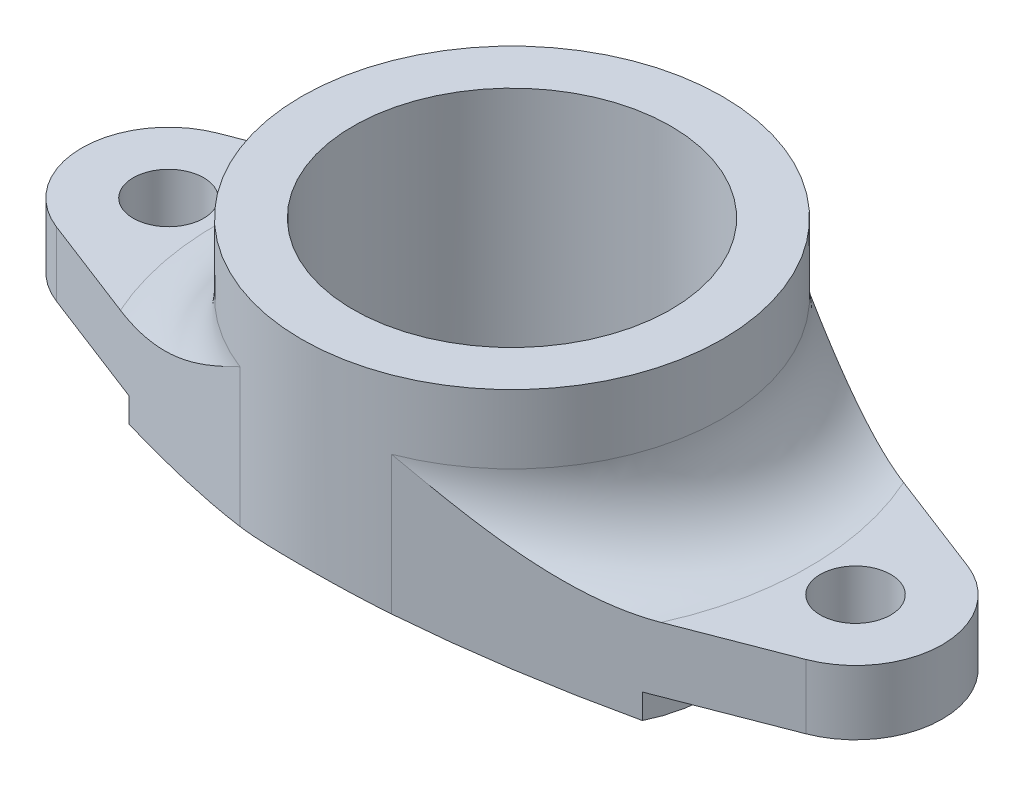
ISO-10303-21;
HEADER;
FILE_DESCRIPTION(('STEP AP214'),'2;1');
FILE_NAME('part.step','',(''),(''),'','','');
FILE_SCHEMA(('AUTOMOTIVE_DESIGN { 1 0 10303 214 1 1 1 1 }'));
ENDSEC;
DATA;
#1=APPLICATION_CONTEXT('core data for automotive mechanical design processes');
#2=APPLICATION_PROTOCOL_DEFINITION('international standard','automotive_design',2000,#1);
#3=PRODUCT_CONTEXT('',#1,'mechanical');
#4=PRODUCT('Part','Part','',(#3));
#5=PRODUCT_RELATED_PRODUCT_CATEGORY('part','',(#4));
#6=PRODUCT_DEFINITION_FORMATION('','',#4);
#7=PRODUCT_DEFINITION_CONTEXT('part definition',#1,'design');
#8=PRODUCT_DEFINITION('design','',#6,#7);
#9=PRODUCT_DEFINITION_SHAPE('','',#8);
#10=(LENGTH_UNIT() NAMED_UNIT(*) SI_UNIT(.MILLI.,.METRE.));
#11=(NAMED_UNIT(*) PLANE_ANGLE_UNIT() SI_UNIT($,.RADIAN.));
#12=(NAMED_UNIT(*) SI_UNIT($,.STERADIAN.) SOLID_ANGLE_UNIT());
#13=UNCERTAINTY_MEASURE_WITH_UNIT(LENGTH_MEASURE(1.E-05),#10,'distance_accuracy_value','');
#14=(GEOMETRIC_REPRESENTATION_CONTEXT(3) GLOBAL_UNCERTAINTY_ASSIGNED_CONTEXT((#13)) GLOBAL_UNIT_ASSIGNED_CONTEXT((#10,
#11,#12)) REPRESENTATION_CONTEXT('',''));
#15=CARTESIAN_POINT('',(0.,0.,0.));
#16=DIRECTION('',(0.,0.,1.));
#17=DIRECTION('',(1.,0.,0.));
#18=AXIS2_PLACEMENT_3D('',#15,#16,#17);
#19=CARTESIAN_POINT('',(43.636,30.,9.42281826207));
#20=DIRECTION('',(-0.36,0.,-0.932952303175248));
#21=DIRECTION('',(0.932952303175248,0.,-0.36));
#22=AXIS2_PLACEMENT_3D('',#19,#20,#21);
#23=PLANE('',#22);
#24=DIRECTION('',(-0.932952303175248,0.,0.36));
#25=VECTOR('',#24,1.);
#26=CARTESIAN_POINT('',(43.636,4.5,9.42281826207));
#27=LINE('',#26,#25);
#28=CARTESIAN_POINT('',(43.636,4.5,9.42281826207));
#29=VERTEX_POINT('',#28);
#30=CARTESIAN_POINT('',(29.9,4.5,14.7231535344844));
#31=VERTEX_POINT('',#30);
#32=EDGE_CURVE('E407',#29,#31,#27,.T.);
#33=ORIENTED_EDGE('',*,*,#32,.F.);
#34=DIRECTION('',(0.,-1.,0.));
#35=VECTOR('',#34,1.);
#36=CARTESIAN_POINT('',(43.636,30.,9.42281826207));
#37=LINE('',#36,#35);
#38=CARTESIAN_POINT('',(43.636,12.,9.42281826207));
#39=VERTEX_POINT('',#38);
#40=EDGE_CURVE('E192',#39,#29,#37,.T.);
#41=ORIENTED_EDGE('',*,*,#40,.F.);
#42=DIRECTION('',(-0.932952303175248,0.,0.36));
#43=VECTOR('',#42,1.);
#44=CARTESIAN_POINT('',(43.636,12.,9.42281826207));
#45=LINE('',#44,#43);
#46=CARTESIAN_POINT('',(31.4813327057347,12.,14.11296181072));
#47=VERTEX_POINT('',#46);
#48=EDGE_CURVE('E323',#39,#47,#45,.T.);
#49=ORIENTED_EDGE('',*,*,#48,.T.);
#50=CARTESIAN_POINT('',(31.4813327057347,12.,14.11296181072));
#51=CARTESIAN_POINT('',(31.1700685586209,12.0000073378621,14.2330698726001));
#52=CARTESIAN_POINT('',(30.858881958718,12.0082756531447,14.3531480111971));
#53=CARTESIAN_POINT('',(30.2373009510363,12.0403376641734,14.592998603777));
#54=CARTESIAN_POINT('',(29.9269063170056,12.0641262695667,14.7127711450642));
#55=CARTESIAN_POINT('',(28.9988953908541,12.1571533080661,15.0708644069357));
#56=CARTESIAN_POINT('',(28.3831053171273,12.2480616970877,15.3084804413108));
#57=CARTESIAN_POINT('',(27.1700427350477,12.4783617337853,15.7765671034717));
#58=CARTESIAN_POINT('',(26.5726319092312,12.6169420095842,16.0070911040685));
#59=CARTESIAN_POINT('',(25.3875116499694,12.9364455773876,16.4643956113646));
#60=CARTESIAN_POINT('',(24.7998075593472,13.1173914080871,16.6911740564189));
#61=CARTESIAN_POINT('',(23.529605424652,13.5518396718947,17.1813092615457));
#62=CARTESIAN_POINT('',(22.8492668772572,13.8125506148257,17.443832732712));
#63=CARTESIAN_POINT('',(21.5038393557871,14.3761332448327,17.9629952944858));
#64=CARTESIAN_POINT('',(20.838756392451,14.6790212283805,18.2196320657185));
#65=CARTESIAN_POINT('',(19.5223741345824,15.3195610469789,18.7275868788636));
#66=CARTESIAN_POINT('',(18.8710942979931,15.6572584712341,18.9788974125041));
#67=CARTESIAN_POINT('',(17.5817460114523,16.3601085811533,19.4764205780239));
#68=CARTESIAN_POINT('',(16.9436760951365,16.7252581984253,19.7226337757317));
#69=CARTESIAN_POINT('',(15.0355808605786,17.8586796799076,20.4589139500804));
#70=CARTESIAN_POINT('',(13.7824686767599,18.6594284513983,20.9424546248173));
#71=CARTESIAN_POINT('',(11.3010990860921,20.3011376891441,21.8999452163514));
#72=CARTESIAN_POINT('',(10.0728287032619,21.1420763477111,22.3739001402139));
#73=CARTESIAN_POINT('',(8.83640796593997,21.9887639871953,22.8510000561701));
#74=CARTESIAN_POINT('',(8.82820398356585,21.9943819936817,22.8541657417519));
#75=CARTESIAN_POINT('',(8.82,22.,22.8573314277936));
#76=B_SPLINE_CURVE_WITH_KNOTS('',3,(#50,#51,#52,#53,#54,#55,#56,#57,#58,#59,#60,#61,#62,#63,#64,
#65,#66,#67,#68,#69,#70,#71,#72,#73,#74,#75),.UNSPECIFIED.,.F.,.F.,(4,2,2,2,2,2,2,2,2,2,2,2,4),
(0.,1.00065964365005,2.00099125530701,3.99733968029431,5.96126632801906,7.92624017854258,
10.247928116096,12.5705156153744,14.8961845684978,17.2215939618567,21.9107675400965,
26.5974249619811,26.6287299136658),.UNSPECIFIED.);
#77=CARTESIAN_POINT('',(8.82000000000001,22.,22.8573314277936));
#78=VERTEX_POINT('',#77);
#79=EDGE_CURVE('E262',#78,#47,#76,.F.);
#80=ORIENTED_EDGE('',*,*,#79,.F.);
#81=DIRECTION('',(0.,-1.,0.));
#82=VECTOR('',#81,1.);
#83=CARTESIAN_POINT('',(8.82000000000001,30.,22.8573314277936));
#84=LINE('',#83,#82);
#85=CARTESIAN_POINT('',(8.82000000000001,5.89365821452919,22.8573314277936));
#86=VERTEX_POINT('',#85);
#87=EDGE_CURVE('E189',#78,#86,#84,.T.);
#88=ORIENTED_EDGE('',*,*,#87,.T.);
#89=CARTESIAN_POINT('',(55.0978846781216,30.,5.));
#90=DIRECTION('',(0.36,0.,0.932952303175248));
#91=DIRECTION('',(0.932952303175248,0.,-0.36));
#92=AXIS2_PLACEMENT_3D('',#89,#90,#91);
#93=ELLIPSE('',#92,83.3333333333333,30.);
#94=CARTESIAN_POINT('',(29.9,1.61936777756979,14.7231535344844));
#95=VERTEX_POINT('',#94);
#96=EDGE_CURVE('E210',#95,#86,#93,.F.);
#97=ORIENTED_EDGE('',*,*,#96,.F.);
#98=DIRECTION('',(0.,-1.,0.));
#99=VECTOR('',#98,1.);
#100=CARTESIAN_POINT('',(29.9,30.,14.7231535344844));
#101=LINE('',#100,#99);
#102=EDGE_CURVE('E169',#31,#95,#101,.T.);
#103=ORIENTED_EDGE('',*,*,#102,.F.);
#104=EDGE_LOOP('',(#33,#41,#49,#80,#88,#97,#103));
#105=FACE_BOUND('',#104,.T.);
#106=ADVANCED_FACE('F39',(#105),#23,.F.);
#107=CARTESIAN_POINT('',(-43.636,30.,9.42281826207));
#108=DIRECTION('',(0.36,0.,-0.932952303175248));
#109=DIRECTION('',(0.932952303175248,0.,0.36));
#110=AXIS2_PLACEMENT_3D('',#107,#108,#109);
#111=PLANE('',#110);
#112=CARTESIAN_POINT('',(-55.0978846781216,30.,5.));
#113=DIRECTION('',(-0.36,0.,0.932952303175248));
#114=DIRECTION('',(0.932952303175248,0.,0.36));
#115=AXIS2_PLACEMENT_3D('',#112,#113,#114);
#116=ELLIPSE('',#115,83.3333333333333,30.);
#117=CARTESIAN_POINT('',(-8.81999999999999,5.89365821452922,22.8573314277936));
#118=VERTEX_POINT('',#117);
#119=CARTESIAN_POINT('',(-29.9,1.61936777756979,14.7231535344844));
#120=VERTEX_POINT('',#119);
#121=EDGE_CURVE('E348',#118,#120,#116,.F.);
#122=ORIENTED_EDGE('',*,*,#121,.F.);
#123=DIRECTION('',(0.,-1.,0.));
#124=VECTOR('',#123,1.);
#125=CARTESIAN_POINT('',(-8.82000000000001,30.,22.8573314277936));
#126=LINE('',#125,#124);
#127=CARTESIAN_POINT('',(-8.82000000000001,22.,22.8573314277936));
#128=VERTEX_POINT('',#127);
#129=EDGE_CURVE('E186',#128,#118,#126,.T.);
#130=ORIENTED_EDGE('',*,*,#129,.F.);
#131=CARTESIAN_POINT('',(-31.4813327057347,12.,14.11296181072));
#132=CARTESIAN_POINT('',(-31.1700685586209,12.0000073378621,14.2330698726001));
#133=CARTESIAN_POINT('',(-30.858881958718,12.0082756531447,14.3531480111971));
#134=CARTESIAN_POINT('',(-30.2373009510363,12.0403376641734,14.592998603777));
#135=CARTESIAN_POINT('',(-29.9269063170056,12.0641262695667,14.7127711450642));
#136=CARTESIAN_POINT('',(-28.9988953908541,12.1571533080661,15.0708644069357));
#137=CARTESIAN_POINT('',(-28.3831053171273,12.2480616970877,15.3084804413108));
#138=CARTESIAN_POINT('',(-27.1700427350477,12.4783617337853,15.7765671034717));
#139=CARTESIAN_POINT('',(-26.5726319092312,12.6169420095842,16.0070911040685));
#140=CARTESIAN_POINT('',(-25.3875116499694,12.9364455773876,16.4643956113646));
#141=CARTESIAN_POINT('',(-24.7998075593472,13.1173914080871,16.6911740564189));
#142=CARTESIAN_POINT('',(-23.529605424652,13.5518396718947,17.1813092615457));
#143=CARTESIAN_POINT('',(-22.8492668772572,13.8125506148257,17.443832732712));
#144=CARTESIAN_POINT('',(-21.5038393557871,14.3761332448327,17.9629952944858));
#145=CARTESIAN_POINT('',(-20.838756392451,14.6790212283805,18.2196320657185));
#146=CARTESIAN_POINT('',(-19.5223741345824,15.3195610469789,18.7275868788636));
#147=CARTESIAN_POINT('',(-18.8710942979931,15.6572584712341,18.9788974125041));
#148=CARTESIAN_POINT('',(-17.5817460114523,16.3601085811533,19.4764205780239));
#149=CARTESIAN_POINT('',(-16.9436760951365,16.7252581984253,19.7226337757317));
#150=CARTESIAN_POINT('',(-15.0355808605786,17.8586796799076,20.4589139500804));
#151=CARTESIAN_POINT('',(-13.7824686767599,18.6594284513983,20.9424546248173));
#152=CARTESIAN_POINT('',(-11.3010990860921,20.3011376891441,21.8999452163514));
#153=CARTESIAN_POINT('',(-10.0728287032619,21.1420763477111,22.3739001402139));
#154=CARTESIAN_POINT('',(-8.83640796593997,21.9887639871953,22.8510000561701));
#155=CARTESIAN_POINT('',(-8.82820398356585,21.9943819936817,22.8541657417519));
#156=CARTESIAN_POINT('',(-8.82,22.,22.8573314277936));
#157=B_SPLINE_CURVE_WITH_KNOTS('',3,(#131,#132,#133,#134,#135,#136,#137,#138,#139,#140,#141,
#142,#143,#144,#145,#146,#147,#148,#149,#150,#151,#152,#153,#154,#155,#156),.UNSPECIFIED.,.F.,
.F.,(4,2,2,2,2,2,2,2,2,2,2,2,4),(0.,1.00065964365005,2.00099125530701,3.99733968029431,
5.96126632801906,7.92624017854258,10.247928116096,12.5705156153744,14.8961845684978,
17.2215939618567,21.9107675400965,26.5974249619811,26.6287299136658),.UNSPECIFIED.);
#158=CARTESIAN_POINT('',(-31.4813327057347,12.,14.11296181072));
#159=VERTEX_POINT('',#158);
#160=EDGE_CURVE('E254',#159,#128,#157,.T.);
#161=ORIENTED_EDGE('',*,*,#160,.F.);
#162=DIRECTION('',(-0.932952303175248,0.,-0.36));
#163=VECTOR('',#162,1.);
#164=CARTESIAN_POINT('',(-43.636,12.,9.42281826207));
#165=LINE('',#164,#163);
#166=CARTESIAN_POINT('',(-43.636,12.,9.42281826207));
#167=VERTEX_POINT('',#166);
#168=EDGE_CURVE('E363',#159,#167,#165,.T.);
#169=ORIENTED_EDGE('',*,*,#168,.T.);
#170=DIRECTION('',(0.,-1.,0.));
#171=VECTOR('',#170,1.);
#172=CARTESIAN_POINT('',(-43.636,30.,9.42281826207));
#173=LINE('',#172,#171);
#174=CARTESIAN_POINT('',(-43.636,4.5,9.42281826207));
#175=VERTEX_POINT('',#174);
#176=EDGE_CURVE('E178',#167,#175,#173,.T.);
#177=ORIENTED_EDGE('',*,*,#176,.T.);
#178=DIRECTION('',(-0.932952303175248,0.,-0.36));
#179=VECTOR('',#178,1.);
#180=CARTESIAN_POINT('',(-43.636,4.5,9.42281826207));
#181=LINE('',#180,#179);
#182=CARTESIAN_POINT('',(-29.9,4.5,14.7231535344844));
#183=VERTEX_POINT('',#182);
#184=EDGE_CURVE('E379',#183,#175,#181,.T.);
#185=ORIENTED_EDGE('',*,*,#184,.F.);
#186=DIRECTION('',(0.,1.,0.));
#187=VECTOR('',#186,1.);
#188=CARTESIAN_POINT('',(-29.9,30.,14.7231535344844));
#189=LINE('',#188,#187);
#190=EDGE_CURVE('E350',#120,#183,#189,.T.);
#191=ORIENTED_EDGE('',*,*,#190,.F.);
#192=EDGE_LOOP('',(#122,#130,#161,#169,#177,#185,#191));
#193=FACE_BOUND('',#192,.T.);
#194=ADVANCED_FACE('F243',(#193),#111,.F.);
#195=CARTESIAN_POINT('',(-40.,30.,0.));
#196=DIRECTION('',(0.,1.,0.));
#197=DIRECTION('',(0.,0.,-1.));
#198=AXIS2_PLACEMENT_3D('',#195,#196,#197);
#199=PLANE('',#198);
#200=CARTESIAN_POINT('',(0.,30.,0.));
#201=DIRECTION('',(0.,-1.,0.));
#202=DIRECTION('',(0.,0.,-1.));
#203=AXIS2_PLACEMENT_3D('',#200,#201,#202);
#204=CIRCLE('',#203,18.5);
#205=CARTESIAN_POINT('',(0.,30.,-18.5));
#206=VERTEX_POINT('',#205);
#207=EDGE_CURVE('E332',#206,#206,#204,.T.);
#208=ORIENTED_EDGE('',*,*,#207,.T.);
#209=EDGE_LOOP('',(#208));
#210=FACE_BOUND('',#209,.T.);
#211=CARTESIAN_POINT('',(0.,30.,0.));
#212=DIRECTION('',(0.,-1.,0.));
#213=DIRECTION('',(0.,0.,-1.));
#214=AXIS2_PLACEMENT_3D('',#211,#212,#213);
#215=CIRCLE('',#214,24.5);
#216=CARTESIAN_POINT('',(0.,30.,-24.5));
#217=VERTEX_POINT('',#216);
#218=EDGE_CURVE('E175',#217,#217,#215,.T.);
#219=ORIENTED_EDGE('',*,*,#218,.F.);
#220=EDGE_LOOP('',(#219));
#221=FACE_BOUND('',#220,.T.);
#222=ADVANCED_FACE('F239',(#210,#221),#199,.T.);
#223=CARTESIAN_POINT('',(-40.,30.,0.));
#224=DIRECTION('',(0.,-1.,0.));
#225=DIRECTION('',(0.,0.,1.));
#226=AXIS2_PLACEMENT_3D('',#223,#224,#225);
#227=CYLINDRICAL_SURFACE('',#226,10.1);
#228=ORIENTED_EDGE('',*,*,#176,.F.);
#229=CARTESIAN_POINT('',(-40.,12.,0.));
#230=DIRECTION('',(0.,-1.,0.));
#231=DIRECTION('',(0.,0.,-1.));
#232=AXIS2_PLACEMENT_3D('',#229,#230,#231);
#233=CIRCLE('',#232,10.1);
#234=CARTESIAN_POINT('',(-43.636,12.,-9.42281826207));
#235=VERTEX_POINT('',#234);
#236=EDGE_CURVE('E328',#167,#235,#233,.T.);
#237=ORIENTED_EDGE('',*,*,#236,.T.);
#238=DIRECTION('',(0.,-1.,0.));
#239=VECTOR('',#238,1.);
#240=CARTESIAN_POINT('',(-43.636,30.,-9.42281826207));
#241=LINE('',#240,#239);
#242=CARTESIAN_POINT('',(-43.636,4.5,-9.42281826207));
#243=VERTEX_POINT('',#242);
#244=EDGE_CURVE('E202',#235,#243,#241,.T.);
#245=ORIENTED_EDGE('',*,*,#244,.T.);
#246=CARTESIAN_POINT('',(-40.,4.5,0.));
#247=DIRECTION('',(0.,-1.,0.));
#248=DIRECTION('',(0.,0.,-1.));
#249=AXIS2_PLACEMENT_3D('',#246,#247,#248);
#250=CIRCLE('',#249,10.1);
#251=EDGE_CURVE('E374',#175,#243,#250,.T.);
#252=ORIENTED_EDGE('',*,*,#251,.F.);
#253=EDGE_LOOP('',(#228,#237,#245,#252));
#254=FACE_BOUND('',#253,.T.);
#255=ADVANCED_FACE('F242',(#254),#227,.T.);
#256=CARTESIAN_POINT('',(-43.636,30.,-9.42281826207));
#257=DIRECTION('',(0.36,0.,0.932952303175248));
#258=DIRECTION('',(-0.932952303175248,0.,0.36));
#259=AXIS2_PLACEMENT_3D('',#256,#257,#258);
#260=PLANE('',#259);
#261=DIRECTION('',(0.932952303175248,0.,-0.36));
#262=VECTOR('',#261,1.);
#263=CARTESIAN_POINT('',(-43.636,4.5,-9.42281826207));
#264=LINE('',#263,#262);
#265=CARTESIAN_POINT('',(-29.9,4.5,-14.7231535344844));
#266=VERTEX_POINT('',#265);
#267=EDGE_CURVE('E370',#243,#266,#264,.T.);
#268=ORIENTED_EDGE('',*,*,#267,.F.);
#269=ORIENTED_EDGE('',*,*,#244,.F.);
#270=DIRECTION('',(0.932952303175248,0.,-0.36));
#271=VECTOR('',#270,1.);
#272=CARTESIAN_POINT('',(-43.636,12.,-9.42281826207));
#273=LINE('',#272,#271);
#274=CARTESIAN_POINT('',(-31.4813327057347,12.,-14.11296181072));
#275=VERTEX_POINT('',#274);
#276=EDGE_CURVE('E324',#235,#275,#273,.T.);
#277=ORIENTED_EDGE('',*,*,#276,.T.);
#278=CARTESIAN_POINT('',(-31.4813327057347,12.,-14.11296181072));
#279=CARTESIAN_POINT('',(-31.1700685586209,12.0000073378621,-14.2330698726001));
#280=CARTESIAN_POINT('',(-30.858881958718,12.0082756531447,-14.3531480111971));
#281=CARTESIAN_POINT('',(-30.2373009510363,12.0403376641734,-14.592998603777));
#282=CARTESIAN_POINT('',(-29.9269063170056,12.0641262695667,-14.7127711450642));
#283=CARTESIAN_POINT('',(-28.998895390854,12.1571533080662,-15.0708644069357));
#284=CARTESIAN_POINT('',(-28.3831053171273,12.2480616970877,-15.3084804413108));
#285=CARTESIAN_POINT('',(-27.1700427350477,12.4783617337853,-15.7765671034717));
#286=CARTESIAN_POINT('',(-26.5726319092312,12.6169420095842,-16.0070911040686));
#287=CARTESIAN_POINT('',(-25.3875116499694,12.9364455773877,-16.4643956113646));
#288=CARTESIAN_POINT('',(-24.7998075593472,13.1173914080871,-16.6911740564189));
#289=CARTESIAN_POINT('',(-23.529605424652,13.5518396718947,-17.1813092615457));
#290=CARTESIAN_POINT('',(-22.8492668772572,13.8125506148257,-17.443832732712));
#291=CARTESIAN_POINT('',(-21.5038393557871,14.3761332448327,-17.9629952944858));
#292=CARTESIAN_POINT('',(-20.838756392451,14.6790212283805,-18.2196320657185));
#293=CARTESIAN_POINT('',(-19.5223741345824,15.3195610469789,-18.7275868788636));
#294=CARTESIAN_POINT('',(-18.8710942979931,15.6572584712341,-18.9788974125041));
#295=CARTESIAN_POINT('',(-17.5817460114523,16.3601085811533,-19.4764205780239));
#296=CARTESIAN_POINT('',(-16.9436760951365,16.7252581984253,-19.7226337757317));
#297=CARTESIAN_POINT('',(-15.0355808605786,17.8586796799076,-20.4589139500804));
#298=CARTESIAN_POINT('',(-13.7824686767599,18.6594284513983,-20.9424546248173));
#299=CARTESIAN_POINT('',(-11.3010990860921,20.3011376891441,-21.8999452163514));
#300=CARTESIAN_POINT('',(-10.072828703262,21.1420763477112,-22.373900140214));
#301=CARTESIAN_POINT('',(-8.83640796593997,21.9887639871953,-22.8510000561701));
#302=CARTESIAN_POINT('',(-8.82820398356585,21.9943819936817,-22.8541657417519));
#303=CARTESIAN_POINT('',(-8.81999999999999,22.,-22.8573314277936));
#304=B_SPLINE_CURVE_WITH_KNOTS('',3,(#278,#279,#280,#281,#282,#283,#284,#285,#286,#287,#288,
#289,#290,#291,#292,#293,#294,#295,#296,#297,#298,#299,#300,#301,#302,#303),.UNSPECIFIED.,.F.,
.F.,(4,2,2,2,2,2,2,2,2,2,2,2,4),(0.,1.00065964365005,2.00099125530701,3.99733968029432,
5.96126632801908,7.92624017854258,10.247928116096,12.5705156153745,14.8961845684978,
17.2215939618567,21.9107675400965,26.5974249619811,26.6287299136658),.UNSPECIFIED.);
#305=CARTESIAN_POINT('',(-8.82000000000002,22.,-22.8573314277936));
#306=VERTEX_POINT('',#305);
#307=EDGE_CURVE('E261',#306,#275,#304,.F.);
#308=ORIENTED_EDGE('',*,*,#307,.F.);
#309=DIRECTION('',(0.,-1.,0.));
#310=VECTOR('',#309,1.);
#311=CARTESIAN_POINT('',(-8.82000000000002,30.,-22.8573314277936));
#312=LINE('',#311,#310);
#313=CARTESIAN_POINT('',(-8.82000000000002,0.,-22.8573314277936));
#314=VERTEX_POINT('',#313);
#315=EDGE_CURVE('E199',#306,#314,#312,.T.);
#316=ORIENTED_EDGE('',*,*,#315,.T.);
#317=DIRECTION('',(0.932952303175248,0.,-0.36));
#318=VECTOR('',#317,1.);
#319=CARTESIAN_POINT('',(-43.636,0.,-9.42281826207));
#320=LINE('',#319,#318);
#321=CARTESIAN_POINT('',(-29.9,0.,-14.7231535344844));
#322=VERTEX_POINT('',#321);
#323=EDGE_CURVE('E180',#322,#314,#320,.T.);
#324=ORIENTED_EDGE('',*,*,#323,.F.);
#325=DIRECTION('',(0.,-1.,0.));
#326=VECTOR('',#325,1.);
#327=CARTESIAN_POINT('',(-29.9,30.,-14.7231535344844));
#328=LINE('',#327,#326);
#329=EDGE_CURVE('E372',#266,#322,#328,.T.);
#330=ORIENTED_EDGE('',*,*,#329,.F.);
#331=EDGE_LOOP('',(#268,#269,#277,#308,#316,#324,#330));
#332=FACE_BOUND('',#331,.T.);
#333=ADVANCED_FACE('F274',(#332),#260,.F.);
#334=CARTESIAN_POINT('',(43.636,30.,-9.42281826207));
#335=DIRECTION('',(-0.36,0.,0.932952303175248));
#336=DIRECTION('',(-0.932952303175248,0.,-0.36));
#337=AXIS2_PLACEMENT_3D('',#334,#335,#336);
#338=PLANE('',#337);
#339=DIRECTION('',(0.932952303175248,0.,0.36));
#340=VECTOR('',#339,1.);
#341=CARTESIAN_POINT('',(43.636,0.,-9.42281826207));
#342=LINE('',#341,#340);
#343=CARTESIAN_POINT('',(8.82000000000001,0.,-22.8573314277936));
#344=VERTEX_POINT('',#343);
#345=CARTESIAN_POINT('',(29.9,0.,-14.7231535344844));
#346=VERTEX_POINT('',#345);
#347=EDGE_CURVE('E165',#344,#346,#342,.T.);
#348=ORIENTED_EDGE('',*,*,#347,.F.);
#349=DIRECTION('',(0.,-1.,0.));
#350=VECTOR('',#349,1.);
#351=CARTESIAN_POINT('',(8.82000000000001,30.,-22.8573314277936));
#352=LINE('',#351,#350);
#353=CARTESIAN_POINT('',(8.82000000000001,22.,-22.8573314277936));
#354=VERTEX_POINT('',#353);
#355=EDGE_CURVE('E197',#354,#344,#352,.T.);
#356=ORIENTED_EDGE('',*,*,#355,.F.);
#357=CARTESIAN_POINT('',(31.4813327057347,12.,-14.11296181072));
#358=CARTESIAN_POINT('',(31.1700685586209,12.0000073378621,-14.2330698726001));
#359=CARTESIAN_POINT('',(30.858881958718,12.0082756531447,-14.3531480111971));
#360=CARTESIAN_POINT('',(30.2373009510363,12.0403376641734,-14.592998603777));
#361=CARTESIAN_POINT('',(29.9269063170056,12.0641262695667,-14.7127711450642));
#362=CARTESIAN_POINT('',(28.9988953908541,12.1571533080661,-15.0708644069357));
#363=CARTESIAN_POINT('',(28.3831053171273,12.2480616970877,-15.3084804413108));
#364=CARTESIAN_POINT('',(27.1700427350477,12.4783617337853,-15.7765671034717));
#365=CARTESIAN_POINT('',(26.5726319092312,12.6169420095842,-16.0070911040685));
#366=CARTESIAN_POINT('',(25.3875116499694,12.9364455773876,-16.4643956113646));
#367=CARTESIAN_POINT('',(24.7998075593472,13.1173914080871,-16.6911740564189));
#368=CARTESIAN_POINT('',(23.529605424652,13.5518396718947,-17.1813092615457));
#369=CARTESIAN_POINT('',(22.8492668772572,13.8125506148257,-17.443832732712));
#370=CARTESIAN_POINT('',(21.5038393557871,14.3761332448327,-17.9629952944858));
#371=CARTESIAN_POINT('',(20.838756392451,14.6790212283805,-18.2196320657185));
#372=CARTESIAN_POINT('',(19.5223741345824,15.3195610469789,-18.7275868788636));
#373=CARTESIAN_POINT('',(18.8710942979931,15.6572584712341,-18.9788974125041));
#374=CARTESIAN_POINT('',(17.5817460114523,16.3601085811533,-19.4764205780239));
#375=CARTESIAN_POINT('',(16.9436760951365,16.7252581984253,-19.7226337757317));
#376=CARTESIAN_POINT('',(15.0355808605786,17.8586796799076,-20.4589139500804));
#377=CARTESIAN_POINT('',(13.7824686767599,18.6594284513983,-20.9424546248173));
#378=CARTESIAN_POINT('',(11.3010990860921,20.3011376891441,-21.8999452163514));
#379=CARTESIAN_POINT('',(10.0728287032619,21.1420763477111,-22.3739001402139));
#380=CARTESIAN_POINT('',(8.83640796593997,21.9887639871953,-22.8510000561701));
#381=CARTESIAN_POINT('',(8.82820398356585,21.9943819936817,-22.8541657417519));
#382=CARTESIAN_POINT('',(8.82,22.,-22.8573314277936));
#383=B_SPLINE_CURVE_WITH_KNOTS('',3,(#357,#358,#359,#360,#361,#362,#363,#364,#365,#366,#367,
#368,#369,#370,#371,#372,#373,#374,#375,#376,#377,#378,#379,#380,#381,#382),.UNSPECIFIED.,.F.,
.F.,(4,2,2,2,2,2,2,2,2,2,2,2,4),(0.,1.00065964365005,2.00099125530701,3.99733968029431,
5.96126632801906,7.92624017854258,10.247928116096,12.5705156153744,14.8961845684978,
17.2215939618567,21.9107675400965,26.5974249619811,26.6287299136658),.UNSPECIFIED.);
#384=CARTESIAN_POINT('',(31.4813327057347,12.,-14.11296181072));
#385=VERTEX_POINT('',#384);
#386=EDGE_CURVE('E289',#385,#354,#383,.T.);
#387=ORIENTED_EDGE('',*,*,#386,.F.);
#388=DIRECTION('',(0.932952303175248,0.,0.36));
#389=VECTOR('',#388,1.);
#390=CARTESIAN_POINT('',(43.636,12.,-9.42281826207));
#391=LINE('',#390,#389);
#392=CARTESIAN_POINT('',(43.636,12.,-9.42281826207));
#393=VERTEX_POINT('',#392);
#394=EDGE_CURVE('E309',#385,#393,#391,.T.);
#395=ORIENTED_EDGE('',*,*,#394,.T.);
#396=DIRECTION('',(0.,-1.,0.));
#397=VECTOR('',#396,1.);
#398=CARTESIAN_POINT('',(43.636,30.,-9.42281826207));
#399=LINE('',#398,#397);
#400=CARTESIAN_POINT('',(43.636,4.5,-9.42281826207));
#401=VERTEX_POINT('',#400);
#402=EDGE_CURVE('E195',#393,#401,#399,.T.);
#403=ORIENTED_EDGE('',*,*,#402,.T.);
#404=DIRECTION('',(0.932952303175248,0.,0.36));
#405=VECTOR('',#404,1.);
#406=CARTESIAN_POINT('',(43.636,4.5,-9.42281826207));
#407=LINE('',#406,#405);
#408=CARTESIAN_POINT('',(29.9,4.5,-14.7231535344844));
#409=VERTEX_POINT('',#408);
#410=EDGE_CURVE('E168',#409,#401,#407,.T.);
#411=ORIENTED_EDGE('',*,*,#410,.F.);
#412=DIRECTION('',(0.,1.,0.));
#413=VECTOR('',#412,1.);
#414=CARTESIAN_POINT('',(29.9,30.,-14.7231535344844));
#415=LINE('',#414,#413);
#416=EDGE_CURVE('E153',#346,#409,#415,.T.);
#417=ORIENTED_EDGE('',*,*,#416,.F.);
#418=EDGE_LOOP('',(#348,#356,#387,#395,#403,#411,#417));
#419=FACE_BOUND('',#418,.T.);
#420=ADVANCED_FACE('F163',(#419),#338,.F.);
#421=CARTESIAN_POINT('',(40.,30.,0.));
#422=DIRECTION('',(0.,-1.,0.));
#423=DIRECTION('',(0.,0.,1.));
#424=AXIS2_PLACEMENT_3D('',#421,#422,#423);
#425=CYLINDRICAL_SURFACE('',#424,10.1);
#426=ORIENTED_EDGE('',*,*,#402,.F.);
#427=CARTESIAN_POINT('',(40.,12.,0.));
#428=DIRECTION('',(0.,-1.,0.));
#429=DIRECTION('',(0.,0.,-1.));
#430=AXIS2_PLACEMENT_3D('',#427,#428,#429);
#431=CIRCLE('',#430,10.1);
#432=EDGE_CURVE('E310',#393,#39,#431,.T.);
#433=ORIENTED_EDGE('',*,*,#432,.T.);
#434=ORIENTED_EDGE('',*,*,#40,.T.);
#435=CARTESIAN_POINT('',(40.,4.5,0.));
#436=DIRECTION('',(0.,-1.,0.));
#437=DIRECTION('',(0.,0.,-1.));
#438=AXIS2_PLACEMENT_3D('',#435,#436,#437);
#439=CIRCLE('',#438,10.1);
#440=EDGE_CURVE('E402',#401,#29,#439,.T.);
#441=ORIENTED_EDGE('',*,*,#440,.F.);
#442=EDGE_LOOP('',(#426,#433,#434,#441));
#443=FACE_BOUND('',#442,.T.);
#444=ADVANCED_FACE('F237',(#443),#425,.T.);
#445=CARTESIAN_POINT('',(-40.,30.,0.));
#446=DIRECTION('',(0.,-1.,0.));
#447=DIRECTION('',(0.,0.,1.));
#448=AXIS2_PLACEMENT_3D('',#445,#446,#447);
#449=CYLINDRICAL_SURFACE('',#448,4.1);
#450=CARTESIAN_POINT('',(-40.,4.5,0.));
#451=DIRECTION('',(0.,-1.,0.));
#452=DIRECTION('',(0.,0.,-1.));
#453=AXIS2_PLACEMENT_3D('',#450,#451,#452);
#454=CIRCLE('',#453,4.1);
#455=CARTESIAN_POINT('',(-40.,4.5,-4.1));
#456=VERTEX_POINT('',#455);
#457=EDGE_CURVE('E375',#456,#456,#454,.T.);
#458=ORIENTED_EDGE('',*,*,#457,.T.);
#459=EDGE_LOOP('',(#458));
#460=FACE_BOUND('',#459,.T.);
#461=CARTESIAN_POINT('',(-40.,12.,0.));
#462=DIRECTION('',(0.,-1.,0.));
#463=DIRECTION('',(0.,0.,-1.));
#464=AXIS2_PLACEMENT_3D('',#461,#462,#463);
#465=CIRCLE('',#464,4.1);
#466=CARTESIAN_POINT('',(-40.,12.,-4.1));
#467=VERTEX_POINT('',#466);
#468=EDGE_CURVE('E209',#467,#467,#465,.T.);
#469=ORIENTED_EDGE('',*,*,#468,.F.);
#470=EDGE_LOOP('',(#469));
#471=FACE_BOUND('',#470,.T.);
#472=ADVANCED_FACE('F233',(#460,#471),#449,.F.);
#473=CARTESIAN_POINT('',(40.,30.,0.));
#474=DIRECTION('',(0.,-1.,0.));
#475=DIRECTION('',(0.,0.,1.));
#476=AXIS2_PLACEMENT_3D('',#473,#474,#475);
#477=CYLINDRICAL_SURFACE('',#476,4.1);
#478=CARTESIAN_POINT('',(40.,4.5,0.));
#479=DIRECTION('',(0.,-1.,0.));
#480=DIRECTION('',(0.,0.,-1.));
#481=AXIS2_PLACEMENT_3D('',#478,#479,#480);
#482=CIRCLE('',#481,4.1);
#483=CARTESIAN_POINT('',(40.,4.5,-4.1));
#484=VERTEX_POINT('',#483);
#485=EDGE_CURVE('E44',#484,#484,#482,.T.);
#486=ORIENTED_EDGE('',*,*,#485,.T.);
#487=EDGE_LOOP('',(#486));
#488=FACE_BOUND('',#487,.T.);
#489=CARTESIAN_POINT('',(40.,12.,0.));
#490=DIRECTION('',(0.,-1.,0.));
#491=DIRECTION('',(0.,0.,-1.));
#492=AXIS2_PLACEMENT_3D('',#489,#490,#491);
#493=CIRCLE('',#492,4.1);
#494=CARTESIAN_POINT('',(40.,12.,-4.1));
#495=VERTEX_POINT('',#494);
#496=EDGE_CURVE('E206',#495,#495,#493,.T.);
#497=ORIENTED_EDGE('',*,*,#496,.F.);
#498=EDGE_LOOP('',(#497));
#499=FACE_BOUND('',#498,.T.);
#500=ADVANCED_FACE('F230',(#488,#499),#477,.F.);
#501=CARTESIAN_POINT('',(-40.,0.,0.));
#502=DIRECTION('',(0.,1.,0.));
#503=DIRECTION('',(0.,0.,-1.));
#504=AXIS2_PLACEMENT_3D('',#501,#502,#503);
#505=PLANE('',#504);
#506=DIRECTION('',(1.,0.,0.));
#507=VECTOR('',#506,1.);
#508=CARTESIAN_POINT('',(-50.1,0.,5.));
#509=LINE('',#508,#507);
#510=CARTESIAN_POINT('',(17.8115131305569,0.,5.));
#511=VERTEX_POINT('',#510);
#512=CARTESIAN_POINT('',(29.9,0.,5.));
#513=VERTEX_POINT('',#512);
#514=EDGE_CURVE('E381',#511,#513,#509,.T.);
#515=ORIENTED_EDGE('',*,*,#514,.F.);
#516=CARTESIAN_POINT('',(0.,0.,0.));
#517=DIRECTION('',(0.,-1.,0.));
#518=DIRECTION('',(0.,0.,-1.));
#519=AXIS2_PLACEMENT_3D('',#516,#517,#518);
#520=CIRCLE('',#519,18.5);
#521=CARTESIAN_POINT('',(-17.8115131305569,0.,5.));
#522=VERTEX_POINT('',#521);
#523=EDGE_CURVE('E312',#522,#511,#520,.T.);
#524=ORIENTED_EDGE('',*,*,#523,.F.);
#525=CARTESIAN_POINT('',(-29.9,0.,5.));
#526=VERTEX_POINT('',#525);
#527=EDGE_CURVE('E354',#526,#522,#509,.T.);
#528=ORIENTED_EDGE('',*,*,#527,.F.);
#529=DIRECTION('',(0.,0.,-1.));
#530=VECTOR('',#529,1.);
#531=CARTESIAN_POINT('',(-29.9,0.,-20.6943859859557));
#532=LINE('',#531,#530);
#533=EDGE_CURVE('E338',#526,#322,#532,.T.);
#534=ORIENTED_EDGE('',*,*,#533,.T.);
#535=ORIENTED_EDGE('',*,*,#323,.T.);
#536=CARTESIAN_POINT('',(0.,0.,0.));
#537=DIRECTION('',(0.,-1.,0.));
#538=DIRECTION('',(0.,0.,-1.));
#539=AXIS2_PLACEMENT_3D('',#536,#537,#538);
#540=CIRCLE('',#539,24.5);
#541=EDGE_CURVE('E173',#314,#344,#540,.T.);
#542=ORIENTED_EDGE('',*,*,#541,.T.);
#543=ORIENTED_EDGE('',*,*,#347,.T.);
#544=DIRECTION('',(0.,0.,1.));
#545=VECTOR('',#544,1.);
#546=CARTESIAN_POINT('',(29.9,0.,-16.6796006230848));
#547=LINE('',#546,#545);
#548=EDGE_CURVE('E150',#346,#513,#547,.T.);
#549=ORIENTED_EDGE('',*,*,#548,.T.);
#550=EDGE_LOOP('',(#515,#524,#528,#534,#535,#542,#543,#549));
#551=FACE_BOUND('',#550,.T.);
#552=ADVANCED_FACE('F171',(#551),#505,.F.);
#553=CARTESIAN_POINT('',(0.,30.,0.));
#554=DIRECTION('',(0.,-1.,0.));
#555=DIRECTION('',(0.,0.,1.));
#556=AXIS2_PLACEMENT_3D('',#553,#554,#555);
#557=CYLINDRICAL_SURFACE('',#556,24.5);
#558=ORIENTED_EDGE('',*,*,#355,.T.);
#559=ORIENTED_EDGE('',*,*,#541,.F.);
#560=ORIENTED_EDGE('',*,*,#315,.F.);
#561=CARTESIAN_POINT('',(0.,22.,0.));
#562=DIRECTION('',(0.,-1.,0.));
#563=DIRECTION('',(0.,0.,-1.));
#564=AXIS2_PLACEMENT_3D('',#561,#562,#563);
#565=CIRCLE('',#564,24.5);
#566=EDGE_CURVE('E298',#128,#306,#565,.T.);
#567=ORIENTED_EDGE('',*,*,#566,.F.);
#568=ORIENTED_EDGE('',*,*,#129,.T.);
#569=CARTESIAN_POINT('',(23.9843699104229,0.,4.99999999999999));
#570=CARTESIAN_POINT('',(23.9211559577665,-9.20971221256653E-06,5.30327450071418));
#571=CARTESIAN_POINT('',(23.8521746353166,0.00459851924593821,5.60533371947271));
#572=CARTESIAN_POINT('',(23.7028918697866,0.0227590821700771,6.20634057840401));
#573=CARTESIAN_POINT('',(23.622591530425,0.0363110444568778,6.50528851890941));
#574=CARTESIAN_POINT('',(23.4509563886905,0.0720540360260355,7.0991624573293));
#575=CARTESIAN_POINT('',(23.3596323855747,0.0942366569634961,7.39409208148277));
#576=CARTESIAN_POINT('',(23.1661594769139,0.14688672732137,7.97960921553937));
#577=CARTESIAN_POINT('',(23.0640103566838,0.177354341069632,8.27019663919696));
#578=CARTESIAN_POINT('',(22.7434135295707,0.280085335277423,9.1301263120883));
#579=CARTESIAN_POINT('',(22.5094314340404,0.363975960196519,9.692410941227));
#580=CARTESIAN_POINT('',(22.002422213712,0.559512312186613,10.7940451938524));
#581=CARTESIAN_POINT('',(21.7293866720134,0.671164026239784,11.3333898406607));
#582=CARTESIAN_POINT('',(21.1480454075837,0.917991793231832,12.3842370172212));
#583=CARTESIAN_POINT('',(20.8398792759125,1.05307578315101,12.8958385885953));
#584=CARTESIAN_POINT('',(20.1900209583542,1.34315545302427,13.8912345393215));
#585=CARTESIAN_POINT('',(19.8483302540789,1.49815025311767,14.3750301460553));
#586=CARTESIAN_POINT('',(19.1330004368488,1.8244240104206,15.3142921647478));
#587=CARTESIAN_POINT('',(18.7592941017593,1.99573731976124,15.7696953203171));
#588=CARTESIAN_POINT('',(17.9826582090524,2.35030873629464,16.6498811790316));
#589=CARTESIAN_POINT('',(17.5797268860979,2.53356756498932,17.0746620293394));
#590=CARTESIAN_POINT('',(16.6968117128728,2.93020489586965,17.941387675195));
#591=CARTESIAN_POINT('',(16.2133652314313,3.14457200324373,18.3793565022276));
#592=CARTESIAN_POINT('',(15.2141494152261,3.57720225259248,19.2146765768324));
#593=CARTESIAN_POINT('',(14.6983765785241,3.795465814835,19.6120234114835));
#594=CARTESIAN_POINT('',(13.6361645400449,4.22968899950247,20.3648921724352));
#595=CARTESIAN_POINT('',(13.0897230391136,4.44564844774548,20.7204109567874));
#596=CARTESIAN_POINT('',(11.9676816779407,4.86861690637881,21.3880973148273));
#597=CARTESIAN_POINT('',(11.3920849625457,5.07562687766462,21.7002695505867));
#598=CARTESIAN_POINT('',(10.2750501071761,5.45269314812981,22.2490194986968));
#599=CARTESIAN_POINT('',(9.73636023751086,5.62434812463729,22.4900916537737));
#600=CARTESIAN_POINT('',(8.63815358369497,5.9493056767509,22.9343207457605));
#601=CARTESIAN_POINT('',(8.07863800100064,6.10260930891983,23.1374798658574));
#602=CARTESIAN_POINT('',(6.94145227144751,6.38501215413044,23.5036703024647));
#603=CARTESIAN_POINT('',(6.36380711142222,6.51414310796457,23.6667543303017));
#604=CARTESIAN_POINT('',(5.19249454388602,6.74290575352427,23.9510143286565));
#605=CARTESIAN_POINT('',(4.59882758500784,6.84253827031398,24.0721914713157));
#606=CARTESIAN_POINT('',(3.3935343988766,7.00820764870739,24.2716000948445));
#607=CARTESIAN_POINT('',(2.78178937184179,7.0739067428077,24.3494003945234));
#608=CARTESIAN_POINT('',(1.55122021475306,7.16654971499093,24.4586422616614));
#609=CARTESIAN_POINT('',(0.932396307645266,7.19349481024479,24.4900852850931));
#610=CARTESIAN_POINT('',(-0.306072092445405,7.20702908355289,24.5059116740337));
#611=CARTESIAN_POINT('',(-0.925716205770392,7.19363291498554,24.4903121270705));
#612=CARTESIAN_POINT('',(-2.15988682953868,7.12731317849849,24.4124388580248));
#613=CARTESIAN_POINT('',(-2.77441356586248,7.07439136468849,24.3501672072045));
#614=CARTESIAN_POINT('',(-3.9060286330932,6.94221968061384,24.1923839954988));
#615=CARTESIAN_POINT('',(-4.42454079127224,6.86778681439103,24.1028620668234));
#616=CARTESIAN_POINT('',(-5.45107787376855,6.69496660177326,23.8916392432761));
#617=CARTESIAN_POINT('',(-5.95909892611648,6.59657057679502,23.7699266887555));
#618=CARTESIAN_POINT('',(-6.96249755928797,6.37919436825238,23.4956246616143));
#619=CARTESIAN_POINT('',(-7.45786753844159,6.26020212810997,23.343017094798));
#620=CARTESIAN_POINT('',(-8.43416159045841,6.00529592842399,23.0082872038024));
#621=CARTESIAN_POINT('',(-8.91508261224087,5.86937842563909,22.826158697108));
#622=CARTESIAN_POINT('',(-9.71774199589375,5.62752739837142,22.4931740545215));
#623=CARTESIAN_POINT('',(-10.0435484066456,5.52499170075199,22.349570254867));
#624=CARTESIAN_POINT('',(-10.6871467454077,5.31471633197582,22.049058986554));
#625=CARTESIAN_POINT('',(-11.004940226887,5.20697768150986,21.8921541227102));
#626=CARTESIAN_POINT('',(-11.9462378606791,4.87759811016858,21.4018254721715));
#627=CARTESIAN_POINT('',(-12.557545419663,4.64982860632408,21.048834984473));
#628=CARTESIAN_POINT('',(-13.7464696351127,4.18645213161127,20.2924131109142));
#629=CARTESIAN_POINT('',(-14.3240244269304,3.95083193995006,19.8888931163007));
#630=CARTESIAN_POINT('',(-15.4424292497629,3.48025088798743,19.0335712910229));
#631=CARTESIAN_POINT('',(-15.9832829629711,3.24528996381646,18.5817743156991));
#632=CARTESIAN_POINT('',(-17.0312030359919,2.78135521254059,17.6265640003156));
#633=CARTESIAN_POINT('',(-17.5378781137787,2.55246459035648,17.122680322694));
#634=CARTESIAN_POINT('',(-18.5084654720808,2.1107077105885,16.0686003707994));
#635=CARTESIAN_POINT('',(-18.9723739674914,1.89784287168978,15.5184000054447));
#636=CARTESIAN_POINT('',(-19.8520158679543,1.4963408449792,14.3758596607202));
#637=CARTESIAN_POINT('',(-20.2679187740246,1.30761814193644,13.7836806585447));
#638=CARTESIAN_POINT('',(-21.0490877986749,0.960791267228517,12.5583953441876));
#639=CARTESIAN_POINT('',(-21.4143699232023,0.802677410948363,11.9253020620921));
#640=CARTESIAN_POINT('',(-22.0044298366125,0.559201627668267,10.7868526736258));
#641=CARTESIAN_POINT('',(-22.2414078621979,0.465548670068387,10.2895545035648));
#642=CARTESIAN_POINT('',(-22.6824468626939,0.302007572706229,9.27692900123631));
#643=CARTESIAN_POINT('',(-22.8865192537529,0.232111181572358,8.76160799757107));
#644=CARTESIAN_POINT('',(-23.2612339066742,0.118157939608863,7.7121556849065));
#645=CARTESIAN_POINT('',(-23.4316457469075,0.0742753362400636,7.17792237865883));
#646=CARTESIAN_POINT('',(-23.6597464695959,0.0299603373832043,6.36752382837803));
#647=CARTESIAN_POINT('',(-23.7312256955692,0.0187732632698759,6.09573044433063));
#648=CARTESIAN_POINT('',(-23.8648401565793,0.00379118371185816,5.54963410126714));
#649=CARTESIAN_POINT('',(-23.9269746960951,-3.27175454092164E-06,5.27533095706102));
#650=CARTESIAN_POINT('',(-23.9843699104229,0.,4.99999999999999));
#651=B_SPLINE_CURVE_WITH_KNOTS('',3,(#569,#570,#571,#572,#573,#574,#575,#576,#577,#578,#579,
#580,#581,#582,#583,#584,#585,#586,#587,#588,#589,#590,#591,#592,#593,#594,#595,#596,#597,#598,
#599,#600,#601,#602,#603,#604,#605,#606,#607,#608,#609,#610,#611,#612,#613,#614,#615,#616,#617,
#618,#619,#620,#621,#622,#623,#624,#625,#626,#627,#628,#629,#630,#631,#632,#633,#634,#635,#636,
#637,#638,#639,#640,#641,#642,#643,#644,#645,#646,#647,#648,#649,#650),.UNSPECIFIED.,.F.,.F.,(4,
2,2,2,2,2,2,2,2,2,2,2,2,2,2,2,2,2,2,2,2,2,2,2,2,2,2,2,2,2,2,2,2,2,2,2,2,2,2,2,4),(0.,
0.929267182089314,1.85844381384911,2.78671746090867,3.71500952106074,5.55670724574204,
7.39880249768406,9.23381781902421,11.0687520787323,12.9076382214904,14.7466355349242,
16.8045426719456,18.8626731302087,20.9209580880614,22.9790214984661,24.8212503217984,
26.6633730293316,28.503059639716,30.3426947896485,32.2003046107585,34.0578560874885,
35.9147329170087,37.7715273450375,39.3641496137275,40.9573495321825,42.5514852490777,
44.145955255225,45.2571632256213,46.3681540830562,48.5905188795415,50.8168368813859,
53.0429311870519,55.2912526482135,57.5397729089462,59.7800939844826,62.0197050615024,
63.6944224644586,65.368557591731,67.0537834082483,67.8973275092574,68.740934363839),.UNSPECIFIED.);
#652=EDGE_CURVE('E317',#86,#118,#651,.T.);
#653=ORIENTED_EDGE('',*,*,#652,.F.);
#654=ORIENTED_EDGE('',*,*,#87,.F.);
#655=CARTESIAN_POINT('',(0.,22.,0.));
#656=DIRECTION('',(0.,-1.,0.));
#657=DIRECTION('',(0.,0.,-1.));
#658=AXIS2_PLACEMENT_3D('',#655,#656,#657);
#659=CIRCLE('',#658,24.5);
#660=EDGE_CURVE('E297',#354,#78,#659,.T.);
#661=ORIENTED_EDGE('',*,*,#660,.F.);
#662=EDGE_LOOP('',(#558,#559,#560,#567,#568,#653,#654,#661));
#663=FACE_BOUND('',#662,.T.);
#664=ORIENTED_EDGE('',*,*,#218,.T.);
#665=EDGE_LOOP('',(#664));
#666=FACE_BOUND('',#665,.T.);
#667=ADVANCED_FACE('F228',(#663,#666),#557,.T.);
#668=CARTESIAN_POINT('',(0.,30.,0.));
#669=DIRECTION('',(0.,-1.,0.));
#670=DIRECTION('',(0.,0.,1.));
#671=AXIS2_PLACEMENT_3D('',#668,#669,#670);
#672=CYLINDRICAL_SURFACE('',#671,18.5);
#673=CARTESIAN_POINT('',(17.8115131305569,0.,4.99999999999999));
#674=CARTESIAN_POINT('',(17.7446859408526,-3.12189635433287E-06,5.23806554663736));
#675=CARTESIAN_POINT('',(17.6730917557426,0.00283450973996523,5.4747528147124));
#676=CARTESIAN_POINT('',(17.5205253597887,0.0139638336628106,5.94493695014211));
#677=CARTESIAN_POINT('',(17.4395538433175,0.0222551223293426,6.17843405229264));
#678=CARTESIAN_POINT('',(17.1829504752525,0.0549487294954418,6.87311110957425));
#679=CARTESIAN_POINT('',(16.9935049532844,0.0871716374634311,7.32892107712597));
#680=CARTESIAN_POINT('',(16.5806651735425,0.169985438078174,8.2201980344141));
#681=CARTESIAN_POINT('',(16.3574487239587,0.220481950242412,8.6557568049176));
#682=CARTESIAN_POINT('',(15.8782377451457,0.337271001435166,9.50630579452874));
#683=CARTESIAN_POINT('',(15.6222382090556,0.403565954645703,9.92129285832535));
#684=CARTESIAN_POINT('',(15.0801860888756,0.548918063261126,10.7272214580324));
#685=CARTESIAN_POINT('',(14.7942093871596,0.627943254152784,11.1182199174686));
#686=CARTESIAN_POINT('',(14.1936828264652,0.795881066738292,11.8753031925435));
#687=CARTESIAN_POINT('',(13.8791339105847,0.884793362105039,12.2413888297956));
#688=CARTESIAN_POINT('',(13.2229569852393,1.06953722729058,12.9474314975133));
#689=CARTESIAN_POINT('',(12.8812947943895,1.16537751714868,13.2873544469945));
#690=CARTESIAN_POINT('',(12.1729326924432,1.36075400837143,13.9392076773001));
#691=CARTESIAN_POINT('',(11.8062209262384,1.46029194939949,14.2511245399057));
#692=CARTESIAN_POINT('',(11.0211755952132,1.66732808423148,14.867791620335));
#693=CARTESIAN_POINT('',(10.6010342619808,1.77486117077785,15.1702326290077));
#694=CARTESIAN_POINT('',(9.73645178490174,1.98636277319479,15.7390970521159));
#695=CARTESIAN_POINT('',(9.29202102205427,2.09033278144225,16.0055356870456));
#696=CARTESIAN_POINT('',(8.38100422636018,2.29075632931534,16.5008356663798));
#697=CARTESIAN_POINT('',(7.914416833119,2.38720940644625,16.7296946995791));
#698=CARTESIAN_POINT('',(6.9617415603129,2.56867657337574,17.1480252864961));
#699=CARTESIAN_POINT('',(6.47565413661775,2.65369093038551,17.3374977603495));
#700=CARTESIAN_POINT('',(5.48344054322836,2.80916669844672,17.6765004117895));
#701=CARTESIAN_POINT('',(4.97719535422109,2.87951899479985,17.8257333818023));
#702=CARTESIAN_POINT('',(3.95163576470758,3.00159510153469,18.0807559321061));
#703=CARTESIAN_POINT('',(3.43232132494501,3.05331885595438,18.1865453818885));
#704=CARTESIAN_POINT('',(2.38530577143346,3.13552708976239,18.3532304138109));
#705=CARTESIAN_POINT('',(1.85761216314696,3.16602958878049,18.4141640869506));
#706=CARTESIAN_POINT('',(0.79813791172162,3.20427408014162,18.4904019117857));
#707=CARTESIAN_POINT('',(0.266357695783951,3.21201841995466,18.5057107696148));
#708=CARTESIAN_POINT('',(-0.742821009428683,3.20474159658364,18.4912597149455));
#709=CARTESIAN_POINT('',(-1.22030532747,3.19193354274429,18.4658813144702));
#710=CARTESIAN_POINT('',(-2.17102094461352,3.14815466005756,18.3783706947725));
#711=CARTESIAN_POINT('',(-2.64425254088724,3.11718511047751,18.3162410642466));
#712=CARTESIAN_POINT('',(-3.58321286775461,3.03836684171527,18.1559219454656));
#713=CARTESIAN_POINT('',(-4.04894003928096,2.9905146612113,18.0577250624369));
#714=CARTESIAN_POINT('',(-4.96977841135172,2.87984804037895,17.8262925151708));
#715=CARTESIAN_POINT('',(-5.42488923436713,2.81703306884518,17.6930556069334));
#716=CARTESIAN_POINT('',(-6.32027734128621,2.67906173338181,17.3932816853216));
#717=CARTESIAN_POINT('',(-6.76060020575931,2.60394850037644,17.2268606220609));
#718=CARTESIAN_POINT('',(-7.62595762120523,2.44385977712839,16.8616558306611));
#719=CARTESIAN_POINT('',(-8.05098559893541,2.35888011138596,16.6628583863158));
#720=CARTESIAN_POINT('',(-8.88373223306171,2.18189616762696,16.2341830002019));
#721=CARTESIAN_POINT('',(-9.2914444064165,2.08988929407714,16.004293550049));
#722=CARTESIAN_POINT('',(-10.0876302585232,1.901809205289,15.5147715556014));
#723=CARTESIAN_POINT('',(-10.4761027271296,1.80573573497159,15.2551371437922));
#724=CARTESIAN_POINT('',(-11.2715205150868,1.60241595364622,14.6788442513877));
#725=CARTESIAN_POINT('',(-11.6761772774426,1.49504793151966,14.3590630896631));
#726=CARTESIAN_POINT('',(-12.457804700236,1.2829336934556,13.6864519511361));
#727=CARTESIAN_POINT('',(-12.8347735486565,1.17818764940688,13.3336198147671));
#728=CARTESIAN_POINT('',(-13.5583836238688,0.97535381093443,12.5970811941018));
#729=CARTESIAN_POINT('',(-13.9050563228358,0.877259131287802,12.2134075637328));
#730=CARTESIAN_POINT('',(-14.5661721201506,0.691447596045445,11.4168516593016));
#731=CARTESIAN_POINT('',(-14.8806155587054,0.603730630902654,11.0039696936359));
#732=CARTESIAN_POINT('',(-15.4700777772279,0.443686375889761,10.158154129106));
#733=CARTESIAN_POINT('',(-15.7456471660608,0.371135173116448,9.72564740752622));
#734=CARTESIAN_POINT('',(-16.2608100168792,0.243056478478891,8.83739917972443));
#735=CARTESIAN_POINT('',(-16.5004101874897,0.187525810094187,8.3816620275071));
#736=CARTESIAN_POINT('',(-16.9425516016978,0.0963232280593579,7.44768766411072));
#737=CARTESIAN_POINT('',(-17.1449019922176,0.0607517731506673,6.96934954239188));
#738=CARTESIAN_POINT('',(-17.4179774923363,0.0246252749118898,6.2395283947291));
#739=CARTESIAN_POINT('',(-17.5039657934401,0.0154546000507923,5.9940666325959));
#740=CARTESIAN_POINT('',(-17.6655677714325,0.00313977892000203,5.4995798222777));
#741=CARTESIAN_POINT('',(-17.7411805435862,-3.84210678563795E-06,5.25055446543924));
#742=CARTESIAN_POINT('',(-17.8115131305569,0.,5.));
#743=B_SPLINE_CURVE_WITH_KNOTS('',3,(#673,#674,#675,#676,#677,#678,#679,#680,#681,#682,#683,
#684,#685,#686,#687,#688,#689,#690,#691,#692,#693,#694,#695,#696,#697,#698,#699,#700,#701,#702,
#703,#704,#705,#706,#707,#708,#709,#710,#711,#712,#713,#714,#715,#716,#717,#718,#719,#720,#721,
#722,#723,#724,#725,#726,#727,#728,#729,#730,#731,#732,#733,#734,#735,#736,#737,#738,#739,#740,
#741,#742),.UNSPECIFIED.,.F.,.F.,(4,2,2,2,2,2,2,2,2,2,2,2,2,2,2,2,2,2,2,2,2,2,2,2,2,2,2,2,2,2,2,
2,2,2,4),(0.,0.741661595328458,1.48326830715948,2.96510249696545,4.43938998123311,
5.91390289807456,7.38476955340015,8.85558767669364,10.3282904346205,11.8016950671021,
13.3860733032076,14.9697796120498,16.5535832848927,18.1373499532842,19.7325123475648,
21.3276795338329,22.9214905552528,24.5151371716828,25.9483671064706,27.3814960989086,
28.8149190861646,30.2483929700431,31.6769431995802,33.1061002141916,34.5357876716288,
35.9655649401293,37.5442227596345,39.1229838014529,40.7000848039598,42.277169157117,
43.8290034090797,45.3805478676176,46.9398330763942,47.72031805131,48.5008710404789),.UNSPECIFIED.);
#744=EDGE_CURVE('E205',#511,#522,#743,.T.);
#745=ORIENTED_EDGE('',*,*,#744,.T.);
#746=ORIENTED_EDGE('',*,*,#523,.T.);
#747=EDGE_LOOP('',(#745,#746));
#748=FACE_BOUND('',#747,.T.);
#749=ORIENTED_EDGE('',*,*,#207,.F.);
#750=EDGE_LOOP('',(#749));
#751=FACE_BOUND('',#750,.T.);
#752=ADVANCED_FACE('F223',(#748,#751),#672,.F.);
#753=CARTESIAN_POINT('',(-40.,12.,0.));
#754=DIRECTION('',(0.,1.,0.));
#755=DIRECTION('',(0.,0.,-1.));
#756=AXIS2_PLACEMENT_3D('',#753,#754,#755);
#757=PLANE('',#756);
#758=ORIENTED_EDGE('',*,*,#496,.T.);
#759=EDGE_LOOP('',(#758));
#760=FACE_BOUND('',#759,.T.);
#761=ORIENTED_EDGE('',*,*,#48,.F.);
#762=ORIENTED_EDGE('',*,*,#432,.F.);
#763=ORIENTED_EDGE('',*,*,#394,.F.);
#764=CARTESIAN_POINT('',(0.,12.,0.));
#765=DIRECTION('',(0.,-1.,0.));
#766=DIRECTION('',(0.,0.,-1.));
#767=AXIS2_PLACEMENT_3D('',#764,#765,#766);
#768=CIRCLE('',#767,34.5);
#769=EDGE_CURVE('E217',#47,#385,#768,.F.);
#770=ORIENTED_EDGE('',*,*,#769,.F.);
#771=EDGE_LOOP('',(#761,#762,#763,#770));
#772=FACE_BOUND('',#771,.T.);
#773=ADVANCED_FACE('F227',(#760,#772),#757,.T.);
#774=ORIENTED_EDGE('',*,*,#468,.T.);
#775=EDGE_LOOP('',(#774));
#776=FACE_BOUND('',#775,.T.);
#777=ORIENTED_EDGE('',*,*,#276,.F.);
#778=ORIENTED_EDGE('',*,*,#236,.F.);
#779=ORIENTED_EDGE('',*,*,#168,.F.);
#780=CARTESIAN_POINT('',(0.,12.,0.));
#781=DIRECTION('',(0.,-1.,0.));
#782=DIRECTION('',(0.,0.,-1.));
#783=AXIS2_PLACEMENT_3D('',#780,#781,#782);
#784=CIRCLE('',#783,34.5);
#785=EDGE_CURVE('E295',#275,#159,#784,.F.);
#786=ORIENTED_EDGE('',*,*,#785,.F.);
#787=EDGE_LOOP('',(#777,#778,#779,#786));
#788=FACE_BOUND('',#787,.T.);
#789=ADVANCED_FACE('F368',(#776,#788),#757,.T.);
#790=CARTESIAN_POINT('',(-50.1,30.,5.));
#791=DIRECTION('',(1.,0.,0.));
#792=DIRECTION('',(0.,0.,1.));
#793=AXIS2_PLACEMENT_3D('',#790,#791,#792);
#794=CYLINDRICAL_SURFACE('',#793,30.);
#795=ORIENTED_EDGE('',*,*,#96,.T.);
#796=ORIENTED_EDGE('',*,*,#652,.T.);
#797=ORIENTED_EDGE('',*,*,#121,.T.);
#798=CARTESIAN_POINT('',(-29.9,30.,5.));
#799=DIRECTION('',(-1.,0.,0.));
#800=DIRECTION('',(0.,0.,1.));
#801=AXIS2_PLACEMENT_3D('',#798,#799,#800);
#802=CIRCLE('',#801,30.);
#803=EDGE_CURVE('E49',#526,#120,#802,.T.);
#804=ORIENTED_EDGE('',*,*,#803,.F.);
#805=ORIENTED_EDGE('',*,*,#527,.T.);
#806=ORIENTED_EDGE('',*,*,#744,.F.);
#807=ORIENTED_EDGE('',*,*,#514,.T.);
#808=CARTESIAN_POINT('',(29.9,30.,5.));
#809=DIRECTION('',(1.,0.,0.));
#810=DIRECTION('',(0.,0.,-1.));
#811=AXIS2_PLACEMENT_3D('',#808,#809,#810);
#812=CIRCLE('',#811,30.);
#813=EDGE_CURVE('E12',#95,#513,#812,.T.);
#814=ORIENTED_EDGE('',*,*,#813,.F.);
#815=EDGE_LOOP('',(#795,#796,#797,#804,#805,#806,#807,#814));
#816=FACE_BOUND('',#815,.T.);
#817=ADVANCED_FACE('F219',(#816),#794,.T.);
#818=CARTESIAN_POINT('',(0.,22.,0.));
#819=DIRECTION('',(0.,1.,0.));
#820=DIRECTION('',(0.,0.,-1.));
#821=AXIS2_PLACEMENT_3D('',#818,#819,#820);
#822=TOROIDAL_SURFACE('',#821,34.5,10.);
#823=ORIENTED_EDGE('',*,*,#79,.T.);
#824=ORIENTED_EDGE('',*,*,#769,.T.);
#825=ORIENTED_EDGE('',*,*,#386,.T.);
#826=ORIENTED_EDGE('',*,*,#660,.T.);
#827=EDGE_LOOP('',(#823,#824,#825,#826));
#828=FACE_BOUND('',#827,.T.);
#829=ADVANCED_FACE('F284',(#828),#822,.F.);
#830=CARTESIAN_POINT('',(0.,22.,0.));
#831=DIRECTION('',(0.,1.,0.));
#832=DIRECTION('',(0.,0.,-1.));
#833=AXIS2_PLACEMENT_3D('',#830,#831,#832);
#834=TOROIDAL_SURFACE('',#833,34.5,10.);
#835=ORIENTED_EDGE('',*,*,#307,.T.);
#836=ORIENTED_EDGE('',*,*,#785,.T.);
#837=ORIENTED_EDGE('',*,*,#160,.T.);
#838=ORIENTED_EDGE('',*,*,#566,.T.);
#839=EDGE_LOOP('',(#835,#836,#837,#838));
#840=FACE_BOUND('',#839,.T.);
#841=ADVANCED_FACE('F41',(#840),#834,.F.);
#842=CARTESIAN_POINT('',(0.,4.5,0.));
#843=DIRECTION('',(0.,1.,0.));
#844=DIRECTION('',(0.,0.,-1.));
#845=AXIS2_PLACEMENT_3D('',#842,#843,#844);
#846=PLANE('',#845);
#847=ORIENTED_EDGE('',*,*,#457,.F.);
#848=EDGE_LOOP('',(#847));
#849=FACE_BOUND('',#848,.T.);
#850=DIRECTION('',(0.,0.,-1.));
#851=VECTOR('',#850,1.);
#852=CARTESIAN_POINT('',(-29.9,4.5,-20.6943859859557));
#853=LINE('',#852,#851);
#854=EDGE_CURVE('E411',#183,#266,#853,.T.);
#855=ORIENTED_EDGE('',*,*,#854,.F.);
#856=ORIENTED_EDGE('',*,*,#184,.T.);
#857=ORIENTED_EDGE('',*,*,#251,.T.);
#858=ORIENTED_EDGE('',*,*,#267,.T.);
#859=EDGE_LOOP('',(#855,#856,#857,#858));
#860=FACE_BOUND('',#859,.T.);
#861=ADVANCED_FACE('F378',(#849,#860),#846,.F.);
#862=CARTESIAN_POINT('',(-29.9,4.5,-20.6943859859557));
#863=DIRECTION('',(1.,0.,0.));
#864=DIRECTION('',(0.,0.,1.));
#865=AXIS2_PLACEMENT_3D('',#862,#863,#864);
#866=PLANE('',#865);
#867=ORIENTED_EDGE('',*,*,#854,.T.);
#868=ORIENTED_EDGE('',*,*,#329,.T.);
#869=ORIENTED_EDGE('',*,*,#533,.F.);
#870=ORIENTED_EDGE('',*,*,#803,.T.);
#871=ORIENTED_EDGE('',*,*,#190,.T.);
#872=EDGE_LOOP('',(#867,#868,#869,#870,#871));
#873=FACE_BOUND('',#872,.T.);
#874=ADVANCED_FACE('F419',(#873),#866,.F.);
#875=CARTESIAN_POINT('',(0.,4.5,0.));
#876=DIRECTION('',(0.,1.,0.));
#877=DIRECTION('',(0.,0.,-1.));
#878=AXIS2_PLACEMENT_3D('',#875,#876,#877);
#879=PLANE('',#878);
#880=ORIENTED_EDGE('',*,*,#485,.F.);
#881=EDGE_LOOP('',(#880));
#882=FACE_BOUND('',#881,.T.);
#883=ORIENTED_EDGE('',*,*,#440,.T.);
#884=ORIENTED_EDGE('',*,*,#32,.T.);
#885=DIRECTION('',(0.,0.,1.));
#886=VECTOR('',#885,1.);
#887=CARTESIAN_POINT('',(29.9,4.5,-16.6796006230848));
#888=LINE('',#887,#886);
#889=EDGE_CURVE('E159',#409,#31,#888,.T.);
#890=ORIENTED_EDGE('',*,*,#889,.F.);
#891=ORIENTED_EDGE('',*,*,#410,.T.);
#892=EDGE_LOOP('',(#883,#884,#890,#891));
#893=FACE_BOUND('',#892,.T.);
#894=ADVANCED_FACE('F406',(#882,#893),#879,.F.);
#895=CARTESIAN_POINT('',(29.9,4.5,-16.6796006230848));
#896=DIRECTION('',(-1.,0.,0.));
#897=DIRECTION('',(0.,0.,-1.));
#898=AXIS2_PLACEMENT_3D('',#895,#896,#897);
#899=PLANE('',#898);
#900=ORIENTED_EDGE('',*,*,#548,.F.);
#901=ORIENTED_EDGE('',*,*,#416,.T.);
#902=ORIENTED_EDGE('',*,*,#889,.T.);
#903=ORIENTED_EDGE('',*,*,#102,.T.);
#904=ORIENTED_EDGE('',*,*,#813,.T.);
#905=EDGE_LOOP('',(#900,#901,#902,#903,#904));
#906=FACE_BOUND('',#905,.T.);
#907=ADVANCED_FACE('F152',(#906),#899,.F.);
#908=CLOSED_SHELL('',(#106,#194,#222,#255,#333,#420,#444,#472,#500,#552,#667,#752,#773,#789,
#817,#829,#841,#861,#874,#894,#907));
#909=MANIFOLD_SOLID_BREP('B2',#908);
#910=ADVANCED_BREP_SHAPE_REPRESENTATION('',(#18,#909),#14);
#911=SHAPE_DEFINITION_REPRESENTATION(#9,#910);
ENDSEC;
END-ISO-10303-21;
